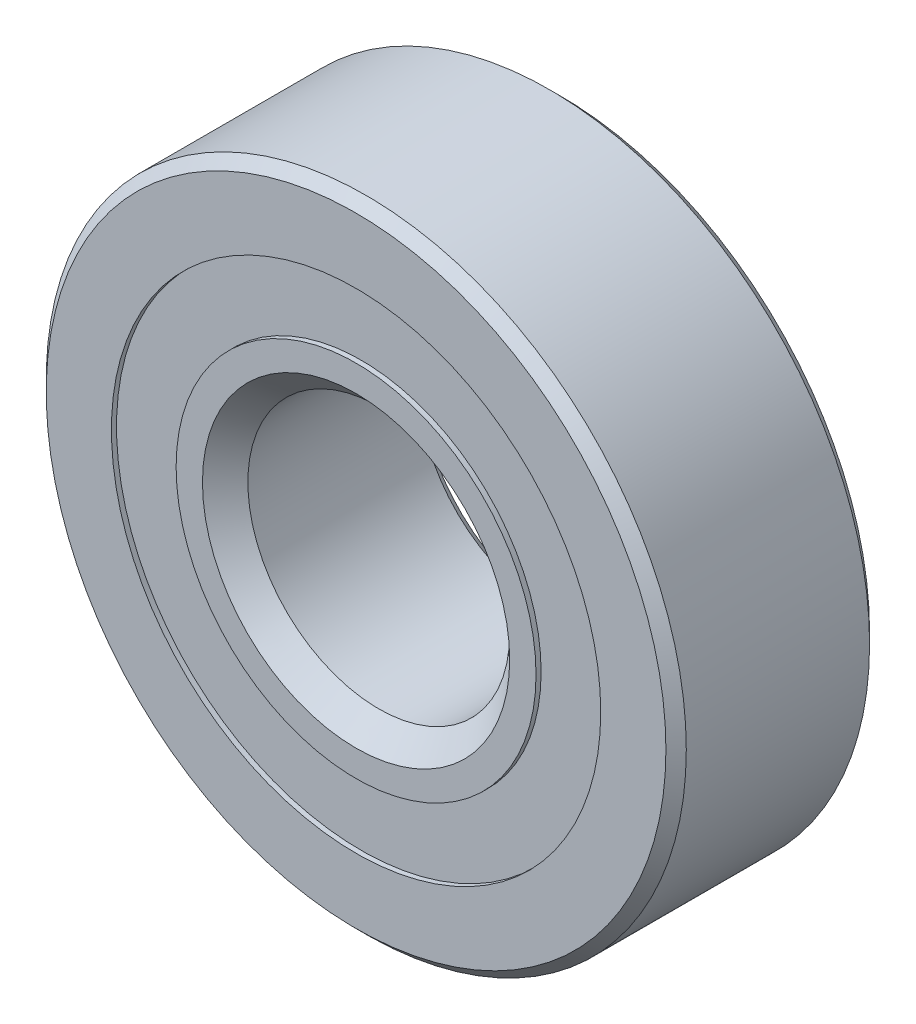
ISO-10303-21;
HEADER;
FILE_DESCRIPTION(('STEP AP214'),'2;1');
FILE_NAME('part.step','',(''),(''),'','','');
FILE_SCHEMA(('AUTOMOTIVE_DESIGN { 1 0 10303 214 1 1 1 1 }'));
ENDSEC;
DATA;
#1=APPLICATION_CONTEXT('core data for automotive mechanical design processes');
#2=APPLICATION_PROTOCOL_DEFINITION('international standard','automotive_design',2000,#1);
#3=PRODUCT_CONTEXT('',#1,'mechanical');
#4=PRODUCT('Part','Part','',(#3));
#5=PRODUCT_RELATED_PRODUCT_CATEGORY('part','',(#4));
#6=PRODUCT_DEFINITION_FORMATION('','',#4);
#7=PRODUCT_DEFINITION_CONTEXT('part definition',#1,'design');
#8=PRODUCT_DEFINITION('design','',#6,#7);
#9=PRODUCT_DEFINITION_SHAPE('','',#8);
#10=(LENGTH_UNIT() NAMED_UNIT(*) SI_UNIT(.MILLI.,.METRE.));
#11=(NAMED_UNIT(*) PLANE_ANGLE_UNIT() SI_UNIT($,.RADIAN.));
#12=(NAMED_UNIT(*) SI_UNIT($,.STERADIAN.) SOLID_ANGLE_UNIT());
#13=UNCERTAINTY_MEASURE_WITH_UNIT(LENGTH_MEASURE(1.E-05),#10,'distance_accuracy_value','');
#14=(GEOMETRIC_REPRESENTATION_CONTEXT(3) GLOBAL_UNCERTAINTY_ASSIGNED_CONTEXT((#13)) GLOBAL_UNIT_ASSIGNED_CONTEXT((#10,
#11,#12)) REPRESENTATION_CONTEXT('',''));
#15=CARTESIAN_POINT('',(0.,0.,0.));
#16=DIRECTION('',(0.,0.,1.));
#17=DIRECTION('',(1.,0.,0.));
#18=AXIS2_PLACEMENT_3D('',#15,#16,#17);
#19=CARTESIAN_POINT('',(0.,13.3498282967033,-5.2784375));
#20=DIRECTION('',(0.,0.,1.));
#21=DIRECTION('',(1.,0.,0.));
#22=AXIS2_PLACEMENT_3D('',#19,#20,#21);
#23=PLANE('',#22);
#24=CARTESIAN_POINT('',(0.,0.,-5.2784375));
#25=DIRECTION('',(0.,0.,1.));
#26=DIRECTION('',(1.,0.,0.));
#27=AXIS2_PLACEMENT_3D('',#24,#25,#26);
#28=CIRCLE('',#27,13.3498282967033);
#29=CARTESIAN_POINT('',(13.3498282967033,0.,-5.2784375));
#30=VERTEX_POINT('',#29);
#31=EDGE_CURVE('E57',#30,#30,#28,.T.);
#32=ORIENTED_EDGE('',*,*,#31,.F.);
#33=EDGE_LOOP('',(#32));
#34=FACE_BOUND('',#33,.T.);
#35=CARTESIAN_POINT('',(0.,0.,-5.2784375));
#36=DIRECTION('',(0.,0.,1.));
#37=DIRECTION('',(1.,0.,0.));
#38=AXIS2_PLACEMENT_3D('',#35,#36,#37);
#39=CIRCLE('',#38,9.81940072197914);
#40=CARTESIAN_POINT('',(9.81940072197914,0.,-5.2784375));
#41=VERTEX_POINT('',#40);
#42=EDGE_CURVE('E11',#41,#41,#39,.T.);
#43=ORIENTED_EDGE('',*,*,#42,.T.);
#44=EDGE_LOOP('',(#43));
#45=FACE_BOUND('',#44,.T.);
#46=ADVANCED_FACE('F43',(#34,#45),#23,.F.);
#47=CARTESIAN_POINT('',(0.,0.,5.55625));
#48=DIRECTION('',(0.,0.,1.));
#49=DIRECTION('',(1.,0.,0.));
#50=AXIS2_PLACEMENT_3D('',#47,#48,#49);
#51=CYLINDRICAL_SURFACE('',#50,9.81940072197914);
#52=ORIENTED_EDGE('',*,*,#42,.F.);
#53=EDGE_LOOP('',(#52));
#54=FACE_BOUND('',#53,.T.);
#55=CARTESIAN_POINT('',(0.,0.,-2.68211551867683));
#56=DIRECTION('',(0.,0.,1.));
#57=DIRECTION('',(1.,0.,0.));
#58=AXIS2_PLACEMENT_3D('',#55,#56,#57);
#59=CIRCLE('',#58,9.81940072197914);
#60=CARTESIAN_POINT('',(9.81940072197914,0.,-2.68211551867683));
#61=VERTEX_POINT('',#60);
#62=EDGE_CURVE('E49',#61,#61,#59,.T.);
#63=ORIENTED_EDGE('',*,*,#62,.T.);
#64=EDGE_LOOP('',(#63));
#65=FACE_BOUND('',#64,.T.);
#66=ADVANCED_FACE('F66',(#54,#65),#51,.F.);
#67=CARTESIAN_POINT('',(0.,13.3498282967033,-2.68211551867683));
#68=DIRECTION('',(0.,0.,-1.));
#69=DIRECTION('',(-1.,0.,0.));
#70=AXIS2_PLACEMENT_3D('',#67,#68,#69);
#71=PLANE('',#70);
#72=ORIENTED_EDGE('',*,*,#62,.F.);
#73=EDGE_LOOP('',(#72));
#74=FACE_BOUND('',#73,.T.);
#75=CARTESIAN_POINT('',(0.,0.,-2.68211551867683));
#76=DIRECTION('',(0.,0.,1.));
#77=DIRECTION('',(1.,0.,0.));
#78=AXIS2_PLACEMENT_3D('',#75,#76,#77);
#79=CIRCLE('',#78,13.3498282967033);
#80=CARTESIAN_POINT('',(13.3498282967033,0.,-2.68211551867683));
#81=VERTEX_POINT('',#80);
#82=EDGE_CURVE('E53',#81,#81,#79,.T.);
#83=ORIENTED_EDGE('',*,*,#82,.T.);
#84=EDGE_LOOP('',(#83));
#85=FACE_BOUND('',#84,.T.);
#86=ADVANCED_FACE('F70',(#74,#85),#71,.F.);
#87=CARTESIAN_POINT('',(0.,0.,5.55625));
#88=DIRECTION('',(0.,0.,1.));
#89=DIRECTION('',(1.,0.,0.));
#90=AXIS2_PLACEMENT_3D('',#87,#88,#89);
#91=CYLINDRICAL_SURFACE('',#90,13.3498282967033);
#92=ORIENTED_EDGE('',*,*,#82,.F.);
#93=EDGE_LOOP('',(#92));
#94=FACE_BOUND('',#93,.T.);
#95=ORIENTED_EDGE('',*,*,#31,.T.);
#96=EDGE_LOOP('',(#95));
#97=FACE_BOUND('',#96,.T.);
#98=ADVANCED_FACE('F63',(#94,#97),#91,.T.);
#99=CLOSED_SHELL('',(#46,#66,#86,#98));
#100=MANIFOLD_SOLID_BREP('B2',#99);
#101=CARTESIAN_POINT('',(0.,13.3498282967033,5.2784375));
#102=DIRECTION('',(0.,0.,-1.));
#103=DIRECTION('',(-1.,0.,0.));
#104=AXIS2_PLACEMENT_3D('',#101,#102,#103);
#105=PLANE('',#104);
#106=CARTESIAN_POINT('',(0.,0.,5.2784375));
#107=DIRECTION('',(0.,0.,1.));
#108=DIRECTION('',(1.,0.,0.));
#109=AXIS2_PLACEMENT_3D('',#106,#107,#108);
#110=CIRCLE('',#109,9.81940072197914);
#111=CARTESIAN_POINT('',(9.81940072197914,0.,5.2784375));
#112=VERTEX_POINT('',#111);
#113=EDGE_CURVE('E42',#112,#112,#110,.T.);
#114=ORIENTED_EDGE('',*,*,#113,.F.);
#115=EDGE_LOOP('',(#114));
#116=FACE_BOUND('',#115,.T.);
#117=CARTESIAN_POINT('',(0.,0.,5.2784375));
#118=DIRECTION('',(0.,0.,1.));
#119=DIRECTION('',(1.,0.,0.));
#120=AXIS2_PLACEMENT_3D('',#117,#118,#119);
#121=CIRCLE('',#120,13.3498282967033);
#122=CARTESIAN_POINT('',(13.3498282967033,0.,5.2784375));
#123=VERTEX_POINT('',#122);
#124=EDGE_CURVE('E124',#123,#123,#121,.T.);
#125=ORIENTED_EDGE('',*,*,#124,.T.);
#126=EDGE_LOOP('',(#125));
#127=FACE_BOUND('',#126,.T.);
#128=ADVANCED_FACE('F110',(#116,#127),#105,.F.);
#129=CARTESIAN_POINT('',(0.,0.,5.55625));
#130=DIRECTION('',(0.,0.,1.));
#131=DIRECTION('',(1.,0.,0.));
#132=AXIS2_PLACEMENT_3D('',#129,#130,#131);
#133=CYLINDRICAL_SURFACE('',#132,9.81940072197914);
#134=CARTESIAN_POINT('',(0.,0.,2.68211551867683));
#135=DIRECTION('',(0.,0.,1.));
#136=DIRECTION('',(1.,0.,0.));
#137=AXIS2_PLACEMENT_3D('',#134,#135,#136);
#138=CIRCLE('',#137,9.81940072197914);
#139=CARTESIAN_POINT('',(9.81940072197914,0.,2.68211551867683));
#140=VERTEX_POINT('',#139);
#141=EDGE_CURVE('E116',#140,#140,#138,.T.);
#142=ORIENTED_EDGE('',*,*,#141,.F.);
#143=EDGE_LOOP('',(#142));
#144=FACE_BOUND('',#143,.T.);
#145=ORIENTED_EDGE('',*,*,#113,.T.);
#146=EDGE_LOOP('',(#145));
#147=FACE_BOUND('',#146,.T.);
#148=ADVANCED_FACE('F139',(#144,#147),#133,.F.);
#149=CARTESIAN_POINT('',(0.,13.3498282967033,2.68211551867683));
#150=DIRECTION('',(0.,0.,1.));
#151=DIRECTION('',(1.,0.,0.));
#152=AXIS2_PLACEMENT_3D('',#149,#150,#151);
#153=PLANE('',#152);
#154=CARTESIAN_POINT('',(0.,0.,2.68211551867683));
#155=DIRECTION('',(0.,0.,1.));
#156=DIRECTION('',(1.,0.,0.));
#157=AXIS2_PLACEMENT_3D('',#154,#155,#156);
#158=CIRCLE('',#157,13.3498282967033);
#159=CARTESIAN_POINT('',(13.3498282967033,0.,2.68211551867683));
#160=VERTEX_POINT('',#159);
#161=EDGE_CURVE('E120',#160,#160,#158,.T.);
#162=ORIENTED_EDGE('',*,*,#161,.F.);
#163=EDGE_LOOP('',(#162));
#164=FACE_BOUND('',#163,.T.);
#165=ORIENTED_EDGE('',*,*,#141,.T.);
#166=EDGE_LOOP('',(#165));
#167=FACE_BOUND('',#166,.T.);
#168=ADVANCED_FACE('F134',(#164,#167),#153,.F.);
#169=CARTESIAN_POINT('',(0.,0.,5.55625));
#170=DIRECTION('',(0.,0.,1.));
#171=DIRECTION('',(1.,0.,0.));
#172=AXIS2_PLACEMENT_3D('',#169,#170,#171);
#173=CYLINDRICAL_SURFACE('',#172,13.3498282967033);
#174=ORIENTED_EDGE('',*,*,#124,.F.);
#175=EDGE_LOOP('',(#174));
#176=FACE_BOUND('',#175,.T.);
#177=ORIENTED_EDGE('',*,*,#161,.T.);
#178=EDGE_LOOP('',(#177));
#179=FACE_BOUND('',#178,.T.);
#180=ADVANCED_FACE('F131',(#176,#179),#173,.T.);
#181=CLOSED_SHELL('',(#128,#148,#168,#180));
#182=MANIFOLD_SOLID_BREP('B6',#181);
#183=CARTESIAN_POINT('',(-6.15156249999986,10.6548187959355,0.));
#184=DIRECTION('',(0.,0.,1.));
#185=DIRECTION('',(-0.499999999999989,0.866025403784445,0.));
#186=AXIS2_PLACEMENT_3D('',#183,#184,#185);
#187=SPHERICAL_SURFACE('',#186,2.68211551867683);
#188=CARTESIAN_POINT('',(-6.15156249999986,10.6548187959355,2.68211551867683));
#189=VERTEX_POINT('',#188);
#190=VERTEX_LOOP('',#189);
#191=FACE_BOUND('',#190,.T.);
#192=ADVANCED_FACE('F190',(#191),#187,.T.);
#193=CLOSED_SHELL('',(#192));
#194=MANIFOLD_SOLID_BREP('B37',#193);
#195=CARTESIAN_POINT('',(-10.6548187959353,6.15156250000012,0.));
#196=DIRECTION('',(0.,0.,1.));
#197=DIRECTION('',(-0.866025403784433,0.50000000000001,0.));
#198=AXIS2_PLACEMENT_3D('',#195,#196,#197);
#199=SPHERICAL_SURFACE('',#198,2.68211551867683);
#200=CARTESIAN_POINT('',(-10.6548187959353,6.15156250000012,2.68211551867683));
#201=VERTEX_POINT('',#200);
#202=VERTEX_LOOP('',#201);
#203=FACE_BOUND('',#202,.T.);
#204=ADVANCED_FACE('F221',(#203),#199,.T.);
#205=CLOSED_SHELL('',(#204));
#206=MANIFOLD_SOLID_BREP('B106',#205);
#207=CARTESIAN_POINT('',(-12.303125,1.28868394040863E-13,0.));
#208=DIRECTION('',(0.,0.,1.));
#209=DIRECTION('',(-1.,0.,0.));
#210=AXIS2_PLACEMENT_3D('',#207,#208,#209);
#211=SPHERICAL_SURFACE('',#210,2.68211551867683);
#212=CARTESIAN_POINT('',(-12.303125,1.28868394040863E-13,2.68211551867683));
#213=VERTEX_POINT('',#212);
#214=VERTEX_LOOP('',#213);
#215=FACE_BOUND('',#214,.T.);
#216=ADVANCED_FACE('F252',(#215),#211,.T.);
#217=CLOSED_SHELL('',(#216));
#218=MANIFOLD_SOLID_BREP('B186',#217);
#219=CARTESIAN_POINT('',(-10.6548187959355,-6.1515624999999,0.));
#220=DIRECTION('',(0.,0.,1.));
#221=DIRECTION('',(-0.866025403784443,-0.499999999999992,0.));
#222=AXIS2_PLACEMENT_3D('',#219,#220,#221);
#223=SPHERICAL_SURFACE('',#222,2.68211551867683);
#224=CARTESIAN_POINT('',(-10.6548187959355,-6.1515624999999,2.68211551867683));
#225=VERTEX_POINT('',#224);
#226=VERTEX_LOOP('',#225);
#227=FACE_BOUND('',#226,.T.);
#228=ADVANCED_FACE('F283',(#227),#223,.T.);
#229=CLOSED_SHELL('',(#228));
#230=MANIFOLD_SOLID_BREP('B217',#229);
#231=CARTESIAN_POINT('',(-6.15156250000009,-10.6548187959354,0.));
#232=DIRECTION('',(0.,0.,1.));
#233=DIRECTION('',(-0.500000000000007,-0.866025403784435,0.));
#234=AXIS2_PLACEMENT_3D('',#231,#232,#233);
#235=SPHERICAL_SURFACE('',#234,2.68211551867683);
#236=CARTESIAN_POINT('',(-6.15156250000009,-10.6548187959354,2.68211551867683));
#237=VERTEX_POINT('',#236);
#238=VERTEX_LOOP('',#237);
#239=FACE_BOUND('',#238,.T.);
#240=ADVANCED_FACE('F314',(#239),#235,.T.);
#241=CLOSED_SHELL('',(#240));
#242=MANIFOLD_SOLID_BREP('B248',#241);
#243=CARTESIAN_POINT('',(0.,-12.303125,0.));
#244=DIRECTION('',(0.,0.,1.));
#245=DIRECTION('',(0.,-1.,0.));
#246=AXIS2_PLACEMENT_3D('',#243,#244,#245);
#247=SPHERICAL_SURFACE('',#246,2.68211551867683);
#248=CARTESIAN_POINT('',(0.,-12.303125,2.68211551867683));
#249=VERTEX_POINT('',#248);
#250=VERTEX_LOOP('',#249);
#251=FACE_BOUND('',#250,.T.);
#252=ADVANCED_FACE('F346',(#251),#247,.T.);
#253=CLOSED_SHELL('',(#252));
#254=MANIFOLD_SOLID_BREP('B279',#253);
#255=CARTESIAN_POINT('',(6.15156249999994,-10.6548187959355,0.));
#256=DIRECTION('',(0.,0.,1.));
#257=DIRECTION('',(0.499999999999995,-0.866025403784442,0.));
#258=AXIS2_PLACEMENT_3D('',#255,#256,#257);
#259=SPHERICAL_SURFACE('',#258,2.68211551867683);
#260=CARTESIAN_POINT('',(6.15156249999994,-10.6548187959355,2.68211551867683));
#261=VERTEX_POINT('',#260);
#262=VERTEX_LOOP('',#261);
#263=FACE_BOUND('',#262,.T.);
#264=ADVANCED_FACE('F381',(#263),#259,.T.);
#265=CLOSED_SHELL('',(#264));
#266=MANIFOLD_SOLID_BREP('B310',#265);
#267=CARTESIAN_POINT('',(10.6548187959354,-6.15156250000005,0.));
#268=DIRECTION('',(0.,0.,1.));
#269=DIRECTION('',(0.866025403784436,-0.500000000000004,0.));
#270=AXIS2_PLACEMENT_3D('',#267,#268,#269);
#271=SPHERICAL_SURFACE('',#270,2.68211551867683);
#272=CARTESIAN_POINT('',(10.6548187959354,-6.15156250000005,2.68211551867683));
#273=VERTEX_POINT('',#272);
#274=VERTEX_LOOP('',#273);
#275=FACE_BOUND('',#274,.T.);
#276=ADVANCED_FACE('F414',(#275),#271,.T.);
#277=CLOSED_SHELL('',(#276));
#278=MANIFOLD_SOLID_BREP('B342',#277);
#279=CARTESIAN_POINT('',(12.303125,0.,0.));
#280=DIRECTION('',(0.,0.,1.));
#281=DIRECTION('',(1.,0.,0.));
#282=AXIS2_PLACEMENT_3D('',#279,#280,#281);
#283=SPHERICAL_SURFACE('',#282,2.68211551867683);
#284=CARTESIAN_POINT('',(12.303125,0.,2.68211551867683));
#285=VERTEX_POINT('',#284);
#286=VERTEX_LOOP('',#285);
#287=FACE_BOUND('',#286,.T.);
#288=ADVANCED_FACE('F447',(#287),#283,.T.);
#289=CLOSED_SHELL('',(#288));
#290=MANIFOLD_SOLID_BREP('B377',#289);
#291=CARTESIAN_POINT('',(10.6548187959354,6.15156249999997,0.));
#292=DIRECTION('',(0.,0.,1.));
#293=DIRECTION('',(0.86602540378444,0.499999999999998,0.));
#294=AXIS2_PLACEMENT_3D('',#291,#292,#293);
#295=SPHERICAL_SURFACE('',#294,2.68211551867683);
#296=CARTESIAN_POINT('',(10.6548187959354,6.15156249999997,2.68211551867683));
#297=VERTEX_POINT('',#296);
#298=VERTEX_LOOP('',#297);
#299=FACE_BOUND('',#298,.T.);
#300=ADVANCED_FACE('F480',(#299),#295,.T.);
#301=CLOSED_SHELL('',(#300));
#302=MANIFOLD_SOLID_BREP('B410',#301);
#303=CARTESIAN_POINT('',(6.15156250000001,10.6548187959354,0.));
#304=DIRECTION('',(0.,0.,1.));
#305=DIRECTION('',(0.500000000000001,0.866025403784438,0.));
#306=AXIS2_PLACEMENT_3D('',#303,#304,#305);
#307=SPHERICAL_SURFACE('',#306,2.68211551867683);
#308=CARTESIAN_POINT('',(6.15156250000001,10.6548187959354,2.68211551867683));
#309=VERTEX_POINT('',#308);
#310=VERTEX_LOOP('',#309);
#311=FACE_BOUND('',#310,.T.);
#312=ADVANCED_FACE('F512',(#311),#307,.T.);
#313=CLOSED_SHELL('',(#312));
#314=MANIFOLD_SOLID_BREP('B443',#313);
#315=CARTESIAN_POINT('',(0.,12.303125,0.));
#316=DIRECTION('',(0.,0.,1.));
#317=DIRECTION('',(0.,1.,0.));
#318=AXIS2_PLACEMENT_3D('',#315,#316,#317);
#319=SPHERICAL_SURFACE('',#318,2.68211551867683);
#320=CARTESIAN_POINT('',(0.,12.303125,2.68211551867683));
#321=VERTEX_POINT('',#320);
#322=VERTEX_LOOP('',#321);
#323=FACE_BOUND('',#322,.T.);
#324=ADVANCED_FACE('F543',(#323),#319,.T.);
#325=CLOSED_SHELL('',(#324));
#326=MANIFOLD_SOLID_BREP('B476',#325);
#327=CARTESIAN_POINT('',(0.,0.,5.55625));
#328=DIRECTION('',(0.,0.,1.));
#329=DIRECTION('',(1.,0.,0.));
#330=AXIS2_PLACEMENT_3D('',#327,#328,#329);
#331=CYLINDRICAL_SURFACE('',#330,9.81940072197914);
#332=CARTESIAN_POINT('',(0.,0.,5.55625));
#333=DIRECTION('',(0.,0.,1.));
#334=DIRECTION('',(1.,0.,0.));
#335=AXIS2_PLACEMENT_3D('',#332,#333,#334);
#336=CIRCLE('',#335,9.81940072197914);
#337=CARTESIAN_POINT('',(9.81940072197914,0.,5.55625));
#338=VERTEX_POINT('',#337);
#339=EDGE_CURVE('E603',#338,#338,#336,.T.);
#340=ORIENTED_EDGE('',*,*,#339,.F.);
#341=EDGE_LOOP('',(#340));
#342=FACE_BOUND('',#341,.T.);
#343=CARTESIAN_POINT('',(0.,0.,5.2784375));
#344=DIRECTION('',(0.,0.,1.));
#345=DIRECTION('',(1.,0.,0.));
#346=AXIS2_PLACEMENT_3D('',#343,#344,#345);
#347=CIRCLE('',#346,9.81940072197914);
#348=CARTESIAN_POINT('',(9.81940072197914,0.,5.2784375));
#349=VERTEX_POINT('',#348);
#350=EDGE_CURVE('E542',#349,#349,#347,.T.);
#351=ORIENTED_EDGE('',*,*,#350,.T.);
#352=EDGE_LOOP('',(#351));
#353=FACE_BOUND('',#352,.T.);
#354=ADVANCED_FACE('F563',(#342,#353),#331,.T.);
#355=CARTESIAN_POINT('',(0.,9.81940072197914,5.2784375));
#356=DIRECTION('',(0.,0.,1.));
#357=DIRECTION('',(1.,0.,0.));
#358=AXIS2_PLACEMENT_3D('',#355,#356,#357);
#359=PLANE('',#358);
#360=ORIENTED_EDGE('',*,*,#350,.F.);
#361=EDGE_LOOP('',(#360));
#362=FACE_BOUND('',#361,.T.);
#363=CARTESIAN_POINT('',(0.,0.,5.2784375));
#364=DIRECTION('',(0.,0.,1.));
#365=DIRECTION('',(1.,0.,0.));
#366=AXIS2_PLACEMENT_3D('',#363,#364,#365);
#367=CIRCLE('',#366,9.54158822197914);
#368=CARTESIAN_POINT('',(9.54158822197914,0.,5.2784375));
#369=VERTEX_POINT('',#368);
#370=EDGE_CURVE('E569',#369,#369,#367,.T.);
#371=ORIENTED_EDGE('',*,*,#370,.T.);
#372=EDGE_LOOP('',(#371));
#373=FACE_BOUND('',#372,.T.);
#374=ADVANCED_FACE('F610',(#362,#373),#359,.F.);
#375=CARTESIAN_POINT('',(0.,0.,4.11922901868245));
#376=DIRECTION('',(0.,0.,1.));
#377=DIRECTION('',(1.,0.,0.));
#378=AXIS2_PLACEMENT_3D('',#375,#376,#377);
#379=CONICAL_SURFACE('',#378,8.38237974066158,0.78539816339745);
#380=ORIENTED_EDGE('',*,*,#370,.F.);
#381=EDGE_LOOP('',(#380));
#382=FACE_BOUND('',#381,.T.);
#383=CARTESIAN_POINT('',(0.,0.,4.11922901868245));
#384=DIRECTION('',(0.,0.,1.));
#385=DIRECTION('',(1.,0.,0.));
#386=AXIS2_PLACEMENT_3D('',#383,#384,#385);
#387=CIRCLE('',#386,8.38237974066158);
#388=CARTESIAN_POINT('',(8.38237974066158,0.,4.11922901868245));
#389=VERTEX_POINT('',#388);
#390=EDGE_CURVE('E573',#389,#389,#387,.T.);
#391=ORIENTED_EDGE('',*,*,#390,.T.);
#392=EDGE_LOOP('',(#391));
#393=FACE_BOUND('',#392,.T.);
#394=ADVANCED_FACE('F614',(#382,#393),#379,.T.);
#395=CARTESIAN_POINT('',(0.,0.,5.55625));
#396=DIRECTION('',(0.,0.,1.));
#397=DIRECTION('',(1.,0.,0.));
#398=AXIS2_PLACEMENT_3D('',#395,#396,#397);
#399=CYLINDRICAL_SURFACE('',#398,8.38237974066158);
#400=ORIENTED_EDGE('',*,*,#390,.F.);
#401=EDGE_LOOP('',(#400));
#402=FACE_BOUND('',#401,.T.);
#403=CARTESIAN_POINT('',(0.,0.,0.));
#404=DIRECTION('',(0.,0.,1.));
#405=DIRECTION('',(1.,0.,0.));
#406=AXIS2_PLACEMENT_3D('',#403,#404,#405);
#407=CIRCLE('',#406,8.38237974066158);
#408=CARTESIAN_POINT('',(8.38237974066158,0.,0.));
#409=VERTEX_POINT('',#408);
#410=EDGE_CURVE('E577',#409,#409,#407,.T.);
#411=ORIENTED_EDGE('',*,*,#410,.T.);
#412=EDGE_LOOP('',(#411));
#413=FACE_BOUND('',#412,.T.);
#414=ADVANCED_FACE('F619',(#402,#413),#399,.T.);
#415=CARTESIAN_POINT('',(0.,8.38237974066158,0.));
#416=DIRECTION('',(0.,0.,-1.));
#417=DIRECTION('',(-1.,0.,0.));
#418=AXIS2_PLACEMENT_3D('',#415,#416,#417);
#419=PLANE('',#418);
#420=ORIENTED_EDGE('',*,*,#410,.F.);
#421=EDGE_LOOP('',(#420));
#422=FACE_BOUND('',#421,.T.);
#423=CARTESIAN_POINT('',(0.,0.,0.));
#424=DIRECTION('',(0.,0.,1.));
#425=DIRECTION('',(1.,0.,0.));
#426=AXIS2_PLACEMENT_3D('',#423,#424,#425);
#427=CIRCLE('',#426,9.62100948132317);
#428=CARTESIAN_POINT('',(9.62100948132317,0.,0.));
#429=VERTEX_POINT('',#428);
#430=EDGE_CURVE('E582',#429,#429,#427,.T.);
#431=ORIENTED_EDGE('',*,*,#430,.T.);
#432=EDGE_LOOP('',(#431));
#433=FACE_BOUND('',#432,.T.);
#434=ADVANCED_FACE('F625',(#422,#433),#419,.F.);
#435=CARTESIAN_POINT('',(0.,0.,0.));
#436=DIRECTION('',(0.,0.,1.));
#437=DIRECTION('',(1.,0.,0.));
#438=AXIS2_PLACEMENT_3D('',#435,#436,#437);
#439=TOROIDAL_SURFACE('',#438,12.303125,2.68211551867683);
#440=ORIENTED_EDGE('',*,*,#430,.F.);
#441=EDGE_LOOP('',(#440));
#442=FACE_BOUND('',#441,.T.);
#443=CARTESIAN_POINT('',(0.,0.,-2.46944444444444));
#444=DIRECTION('',(0.,0.,1.));
#445=DIRECTION('',(1.,0.,0.));
#446=AXIS2_PLACEMENT_3D('',#443,#444,#445);
#447=CIRCLE('',#446,11.2564217032967);
#448=CARTESIAN_POINT('',(11.2564217032967,0.,-2.46944444444444));
#449=VERTEX_POINT('',#448);
#450=EDGE_CURVE('E585',#449,#449,#447,.T.);
#451=ORIENTED_EDGE('',*,*,#450,.T.);
#452=EDGE_LOOP('',(#451));
#453=FACE_BOUND('',#452,.T.);
#454=ADVANCED_FACE('F629',(#442,#453),#439,.F.);
#455=CARTESIAN_POINT('',(0.,0.,5.55625));
#456=DIRECTION('',(0.,0.,1.));
#457=DIRECTION('',(1.,0.,0.));
#458=AXIS2_PLACEMENT_3D('',#455,#456,#457);
#459=CYLINDRICAL_SURFACE('',#458,11.2564217032967);
#460=ORIENTED_EDGE('',*,*,#450,.F.);
#461=EDGE_LOOP('',(#460));
#462=FACE_BOUND('',#461,.T.);
#463=CARTESIAN_POINT('',(0.,0.,-5.55625));
#464=DIRECTION('',(0.,0.,1.));
#465=DIRECTION('',(1.,0.,0.));
#466=AXIS2_PLACEMENT_3D('',#463,#464,#465);
#467=CIRCLE('',#466,11.2564217032967);
#468=CARTESIAN_POINT('',(11.2564217032967,0.,-5.55625));
#469=VERTEX_POINT('',#468);
#470=EDGE_CURVE('E588',#469,#469,#467,.T.);
#471=ORIENTED_EDGE('',*,*,#470,.T.);
#472=EDGE_LOOP('',(#471));
#473=FACE_BOUND('',#472,.T.);
#474=ADVANCED_FACE('F633',(#462,#473),#459,.T.);
#475=CARTESIAN_POINT('',(0.,7.699375,-5.55625));
#476=DIRECTION('',(0.,0.,1.));
#477=DIRECTION('',(1.,0.,0.));
#478=AXIS2_PLACEMENT_3D('',#475,#476,#477);
#479=PLANE('',#478);
#480=ORIENTED_EDGE('',*,*,#470,.F.);
#481=EDGE_LOOP('',(#480));
#482=FACE_BOUND('',#481,.T.);
#483=CARTESIAN_POINT('',(0.,0.,-5.55625));
#484=DIRECTION('',(0.,0.,1.));
#485=DIRECTION('',(1.,0.,0.));
#486=AXIS2_PLACEMENT_3D('',#483,#484,#485);
#487=CIRCLE('',#486,7.699375);
#488=CARTESIAN_POINT('',(7.699375,0.,-5.55625));
#489=VERTEX_POINT('',#488);
#490=EDGE_CURVE('E591',#489,#489,#487,.T.);
#491=ORIENTED_EDGE('',*,*,#490,.T.);
#492=EDGE_LOOP('',(#491));
#493=FACE_BOUND('',#492,.T.);
#494=ADVANCED_FACE('F637',(#482,#493),#479,.F.);
#495=CARTESIAN_POINT('',(0.,0.,-5.000625));
#496=DIRECTION('',(0.,0.,-1.));
#497=DIRECTION('',(-1.,0.,0.));
#498=AXIS2_PLACEMENT_3D('',#495,#496,#497);
#499=CONICAL_SURFACE('',#498,7.14375,0.785398163397449);
#500=ORIENTED_EDGE('',*,*,#490,.F.);
#501=EDGE_LOOP('',(#500));
#502=FACE_BOUND('',#501,.T.);
#503=CARTESIAN_POINT('',(0.,0.,-5.000625));
#504=DIRECTION('',(0.,0.,1.));
#505=DIRECTION('',(1.,0.,0.));
#506=AXIS2_PLACEMENT_3D('',#503,#504,#505);
#507=CIRCLE('',#506,7.14375);
#508=CARTESIAN_POINT('',(7.14375,0.,-5.000625));
#509=VERTEX_POINT('',#508);
#510=EDGE_CURVE('E594',#509,#509,#507,.T.);
#511=ORIENTED_EDGE('',*,*,#510,.T.);
#512=EDGE_LOOP('',(#511));
#513=FACE_BOUND('',#512,.T.);
#514=ADVANCED_FACE('F641',(#502,#513),#499,.F.);
#515=CARTESIAN_POINT('',(0.,0.,5.55625));
#516=DIRECTION('',(0.,0.,1.));
#517=DIRECTION('',(1.,0.,0.));
#518=AXIS2_PLACEMENT_3D('',#515,#516,#517);
#519=CYLINDRICAL_SURFACE('',#518,7.14375);
#520=ORIENTED_EDGE('',*,*,#510,.F.);
#521=EDGE_LOOP('',(#520));
#522=FACE_BOUND('',#521,.T.);
#523=CARTESIAN_POINT('',(0.,0.,4.31762025933842));
#524=DIRECTION('',(0.,0.,1.));
#525=DIRECTION('',(1.,0.,0.));
#526=AXIS2_PLACEMENT_3D('',#523,#524,#525);
#527=CIRCLE('',#526,7.14375);
#528=CARTESIAN_POINT('',(7.14375,0.,4.31762025933842));
#529=VERTEX_POINT('',#528);
#530=EDGE_CURVE('E597',#529,#529,#527,.T.);
#531=ORIENTED_EDGE('',*,*,#530,.T.);
#532=EDGE_LOOP('',(#531));
#533=FACE_BOUND('',#532,.T.);
#534=ADVANCED_FACE('F645',(#522,#533),#519,.F.);
#535=CARTESIAN_POINT('',(0.,0.,5.55625));
#536=DIRECTION('',(0.,0.,1.));
#537=DIRECTION('',(1.,0.,0.));
#538=AXIS2_PLACEMENT_3D('',#535,#536,#537);
#539=CONICAL_SURFACE('',#538,8.38237974066158,0.78539816339745);
#540=ORIENTED_EDGE('',*,*,#530,.F.);
#541=EDGE_LOOP('',(#540));
#542=FACE_BOUND('',#541,.T.);
#543=CARTESIAN_POINT('',(0.,0.,5.55625));
#544=DIRECTION('',(0.,0.,1.));
#545=DIRECTION('',(1.,0.,0.));
#546=AXIS2_PLACEMENT_3D('',#543,#544,#545);
#547=CIRCLE('',#546,8.38237974066158);
#548=CARTESIAN_POINT('',(8.38237974066158,0.,5.55625));
#549=VERTEX_POINT('',#548);
#550=EDGE_CURVE('E600',#549,#549,#547,.T.);
#551=ORIENTED_EDGE('',*,*,#550,.T.);
#552=EDGE_LOOP('',(#551));
#553=FACE_BOUND('',#552,.T.);
#554=ADVANCED_FACE('F649',(#542,#553),#539,.F.);
#555=CARTESIAN_POINT('',(0.,9.81940072197914,5.55625));
#556=DIRECTION('',(0.,0.,-1.));
#557=DIRECTION('',(-1.,0.,0.));
#558=AXIS2_PLACEMENT_3D('',#555,#556,#557);
#559=PLANE('',#558);
#560=ORIENTED_EDGE('',*,*,#550,.F.);
#561=EDGE_LOOP('',(#560));
#562=FACE_BOUND('',#561,.T.);
#563=ORIENTED_EDGE('',*,*,#339,.T.);
#564=EDGE_LOOP('',(#563));
#565=FACE_BOUND('',#564,.T.);
#566=ADVANCED_FACE('F607',(#562,#565),#559,.F.);
#567=CLOSED_SHELL('',(#354,#374,#394,#414,#434,#454,#474,#494,#514,#534,#554,#566));
#568=MANIFOLD_SOLID_BREP('B508',#567);
#569=CARTESIAN_POINT('',(0.,0.,5.000625));
#570=DIRECTION('',(0.,0.,-1.));
#571=DIRECTION('',(-1.,0.,0.));
#572=AXIS2_PLACEMENT_3D('',#569,#570,#571);
#573=CONICAL_SURFACE('',#572,17.4625,0.785398163397447);
#574=CARTESIAN_POINT('',(0.,0.,5.55625));
#575=DIRECTION('',(0.,0.,1.));
#576=DIRECTION('',(1.,0.,0.));
#577=AXIS2_PLACEMENT_3D('',#574,#575,#576);
#578=CIRCLE('',#577,16.906875);
#579=CARTESIAN_POINT('',(16.906875,0.,5.55625));
#580=VERTEX_POINT('',#579);
#581=EDGE_CURVE('E775',#580,#580,#578,.T.);
#582=ORIENTED_EDGE('',*,*,#581,.F.);
#583=EDGE_LOOP('',(#582));
#584=FACE_BOUND('',#583,.T.);
#585=CARTESIAN_POINT('',(0.,0.,5.000625));
#586=DIRECTION('',(0.,0.,1.));
#587=DIRECTION('',(1.,0.,0.));
#588=AXIS2_PLACEMENT_3D('',#585,#586,#587);
#589=CIRCLE('',#588,17.4625);
#590=CARTESIAN_POINT('',(17.4625,0.,5.000625));
#591=VERTEX_POINT('',#590);
#592=EDGE_CURVE('E562',#591,#591,#589,.T.);
#593=ORIENTED_EDGE('',*,*,#592,.T.);
#594=EDGE_LOOP('',(#593));
#595=FACE_BOUND('',#594,.T.);
#596=ADVANCED_FACE('F747',(#584,#595),#573,.T.);
#597=CARTESIAN_POINT('',(0.,0.,5.55625));
#598=DIRECTION('',(0.,0.,1.));
#599=DIRECTION('',(1.,0.,0.));
#600=AXIS2_PLACEMENT_3D('',#597,#598,#599);
#601=CYLINDRICAL_SURFACE('',#600,17.4625);
#602=ORIENTED_EDGE('',*,*,#592,.F.);
#603=EDGE_LOOP('',(#602));
#604=FACE_BOUND('',#603,.T.);
#605=CARTESIAN_POINT('',(0.,0.,-5.000625));
#606=DIRECTION('',(0.,0.,1.));
#607=DIRECTION('',(1.,0.,0.));
#608=AXIS2_PLACEMENT_3D('',#605,#606,#607);
#609=CIRCLE('',#608,17.4625);
#610=CARTESIAN_POINT('',(17.4625,0.,-5.000625));
#611=VERTEX_POINT('',#610);
#612=EDGE_CURVE('E753',#611,#611,#609,.T.);
#613=ORIENTED_EDGE('',*,*,#612,.T.);
#614=EDGE_LOOP('',(#613));
#615=FACE_BOUND('',#614,.T.);
#616=ADVANCED_FACE('F782',(#604,#615),#601,.T.);
#617=CARTESIAN_POINT('',(0.,0.,-5.55625));
#618=DIRECTION('',(0.,0.,1.));
#619=DIRECTION('',(1.,0.,0.));
#620=AXIS2_PLACEMENT_3D('',#617,#618,#619);
#621=CONICAL_SURFACE('',#620,16.906875,0.785398163397448);
#622=ORIENTED_EDGE('',*,*,#612,.F.);
#623=EDGE_LOOP('',(#622));
#624=FACE_BOUND('',#623,.T.);
#625=CARTESIAN_POINT('',(0.,0.,-5.55625));
#626=DIRECTION('',(0.,0.,1.));
#627=DIRECTION('',(1.,0.,0.));
#628=AXIS2_PLACEMENT_3D('',#625,#626,#627);
#629=CIRCLE('',#628,16.906875);
#630=CARTESIAN_POINT('',(16.906875,0.,-5.55625));
#631=VERTEX_POINT('',#630);
#632=EDGE_CURVE('E757',#631,#631,#629,.T.);
#633=ORIENTED_EDGE('',*,*,#632,.T.);
#634=EDGE_LOOP('',(#633));
#635=FACE_BOUND('',#634,.T.);
#636=ADVANCED_FACE('F786',(#624,#635),#621,.T.);
#637=CARTESIAN_POINT('',(0.,16.906875,-5.55625));
#638=DIRECTION('',(0.,0.,1.));
#639=DIRECTION('',(1.,0.,0.));
#640=AXIS2_PLACEMENT_3D('',#637,#638,#639);
#641=PLANE('',#640);
#642=ORIENTED_EDGE('',*,*,#632,.F.);
#643=EDGE_LOOP('',(#642));
#644=FACE_BOUND('',#643,.T.);
#645=CARTESIAN_POINT('',(0.,0.,-5.55625));
#646=DIRECTION('',(0.,0.,1.));
#647=DIRECTION('',(1.,0.,0.));
#648=AXIS2_PLACEMENT_3D('',#645,#646,#647);
#649=CIRCLE('',#648,13.3498282967033);
#650=CARTESIAN_POINT('',(13.3498282967033,0.,-5.55625));
#651=VERTEX_POINT('',#650);
#652=EDGE_CURVE('E761',#651,#651,#649,.T.);
#653=ORIENTED_EDGE('',*,*,#652,.T.);
#654=EDGE_LOOP('',(#653));
#655=FACE_BOUND('',#654,.T.);
#656=ADVANCED_FACE('F791',(#644,#655),#641,.F.);
#657=CARTESIAN_POINT('',(0.,0.,5.55625));
#658=DIRECTION('',(0.,0.,1.));
#659=DIRECTION('',(1.,0.,0.));
#660=AXIS2_PLACEMENT_3D('',#657,#658,#659);
#661=CYLINDRICAL_SURFACE('',#660,13.3498282967033);
#662=ORIENTED_EDGE('',*,*,#652,.F.);
#663=EDGE_LOOP('',(#662));
#664=FACE_BOUND('',#663,.T.);
#665=CARTESIAN_POINT('',(0.,0.,-2.46944444444444));
#666=DIRECTION('',(0.,0.,1.));
#667=DIRECTION('',(1.,0.,0.));
#668=AXIS2_PLACEMENT_3D('',#665,#666,#667);
#669=CIRCLE('',#668,13.3498282967033);
#670=CARTESIAN_POINT('',(13.3498282967033,0.,-2.46944444444444));
#671=VERTEX_POINT('',#670);
#672=EDGE_CURVE('E766',#671,#671,#669,.T.);
#673=ORIENTED_EDGE('',*,*,#672,.T.);
#674=EDGE_LOOP('',(#673));
#675=FACE_BOUND('',#674,.T.);
#676=ADVANCED_FACE('F797',(#664,#675),#661,.F.);
#677=CARTESIAN_POINT('',(0.,0.,0.));
#678=DIRECTION('',(0.,0.,1.));
#679=DIRECTION('',(1.,0.,0.));
#680=AXIS2_PLACEMENT_3D('',#677,#678,#679);
#681=TOROIDAL_SURFACE('',#680,12.303125,2.68211551867683);
#682=ORIENTED_EDGE('',*,*,#672,.F.);
#683=EDGE_LOOP('',(#682));
#684=FACE_BOUND('',#683,.T.);
#685=CARTESIAN_POINT('',(0.,0.,2.46944444444444));
#686=DIRECTION('',(0.,0.,1.));
#687=DIRECTION('',(1.,0.,0.));
#688=AXIS2_PLACEMENT_3D('',#685,#686,#687);
#689=CIRCLE('',#688,13.3498282967033);
#690=CARTESIAN_POINT('',(13.3498282967033,0.,2.46944444444444));
#691=VERTEX_POINT('',#690);
#692=EDGE_CURVE('E769',#691,#691,#689,.T.);
#693=ORIENTED_EDGE('',*,*,#692,.T.);
#694=EDGE_LOOP('',(#693));
#695=FACE_BOUND('',#694,.T.);
#696=ADVANCED_FACE('F801',(#684,#695),#681,.F.);
#697=CARTESIAN_POINT('',(0.,0.,5.55625));
#698=DIRECTION('',(0.,0.,1.));
#699=DIRECTION('',(1.,0.,0.));
#700=AXIS2_PLACEMENT_3D('',#697,#698,#699);
#701=CYLINDRICAL_SURFACE('',#700,13.3498282967033);
#702=ORIENTED_EDGE('',*,*,#692,.F.);
#703=EDGE_LOOP('',(#702));
#704=FACE_BOUND('',#703,.T.);
#705=CARTESIAN_POINT('',(0.,0.,5.55625));
#706=DIRECTION('',(0.,0.,1.));
#707=DIRECTION('',(1.,0.,0.));
#708=AXIS2_PLACEMENT_3D('',#705,#706,#707);
#709=CIRCLE('',#708,13.3498282967033);
#710=CARTESIAN_POINT('',(13.3498282967033,0.,5.55625));
#711=VERTEX_POINT('',#710);
#712=EDGE_CURVE('E772',#711,#711,#709,.T.);
#713=ORIENTED_EDGE('',*,*,#712,.T.);
#714=EDGE_LOOP('',(#713));
#715=FACE_BOUND('',#714,.T.);
#716=ADVANCED_FACE('F805',(#704,#715),#701,.F.);
#717=CARTESIAN_POINT('',(0.,16.906875,5.55625));
#718=DIRECTION('',(0.,0.,-1.));
#719=DIRECTION('',(-1.,0.,0.));
#720=AXIS2_PLACEMENT_3D('',#717,#718,#719);
#721=PLANE('',#720);
#722=ORIENTED_EDGE('',*,*,#712,.F.);
#723=EDGE_LOOP('',(#722));
#724=FACE_BOUND('',#723,.T.);
#725=ORIENTED_EDGE('',*,*,#581,.T.);
#726=EDGE_LOOP('',(#725));
#727=FACE_BOUND('',#726,.T.);
#728=ADVANCED_FACE('F779',(#724,#727),#721,.F.);
#729=CLOSED_SHELL('',(#596,#616,#636,#656,#676,#696,#716,#728));
#730=MANIFOLD_SOLID_BREP('B537',#729);
#731=ADVANCED_BREP_SHAPE_REPRESENTATION('',(#18,#100,#182,#194,#206,#218,#230,#242,#254,#266,
#278,#290,#302,#314,#326,#568,#730),#14);
#732=SHAPE_DEFINITION_REPRESENTATION(#9,#731);
ENDSEC;
END-ISO-10303-21;
